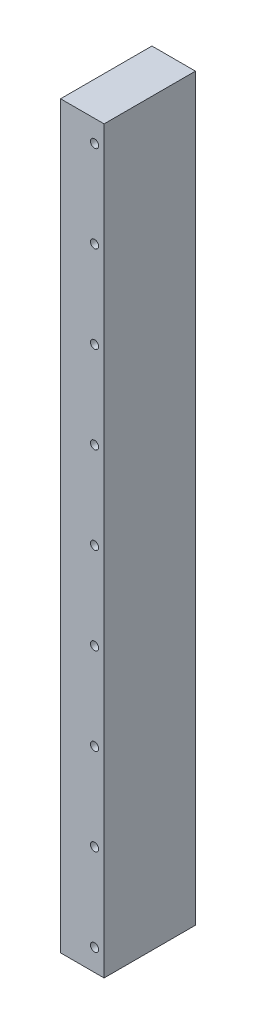
ISO-10303-21;
HEADER;
FILE_DESCRIPTION(('STEP AP214'),'2;1');
FILE_NAME('part.step','',(''),(''),'','','');
FILE_SCHEMA(('AUTOMOTIVE_DESIGN { 1 0 10303 214 1 1 1 1 }'));
ENDSEC;
DATA;
#1=APPLICATION_CONTEXT('core data for automotive mechanical design processes');
#2=APPLICATION_PROTOCOL_DEFINITION('international standard','automotive_design',2000,#1);
#3=PRODUCT_CONTEXT('',#1,'mechanical');
#4=PRODUCT('Part','Part','',(#3));
#5=PRODUCT_RELATED_PRODUCT_CATEGORY('part','',(#4));
#6=PRODUCT_DEFINITION_FORMATION('','',#4);
#7=PRODUCT_DEFINITION_CONTEXT('part definition',#1,'design');
#8=PRODUCT_DEFINITION('design','',#6,#7);
#9=PRODUCT_DEFINITION_SHAPE('','',#8);
#10=(LENGTH_UNIT() NAMED_UNIT(*) SI_UNIT(.MILLI.,.METRE.));
#11=(NAMED_UNIT(*) PLANE_ANGLE_UNIT() SI_UNIT($,.RADIAN.));
#12=(NAMED_UNIT(*) SI_UNIT($,.STERADIAN.) SOLID_ANGLE_UNIT());
#13=UNCERTAINTY_MEASURE_WITH_UNIT(LENGTH_MEASURE(1.E-05),#10,'distance_accuracy_value','');
#14=(GEOMETRIC_REPRESENTATION_CONTEXT(3) GLOBAL_UNCERTAINTY_ASSIGNED_CONTEXT((#13)) GLOBAL_UNIT_ASSIGNED_CONTEXT((#10,
#11,#12)) REPRESENTATION_CONTEXT('',''));
#15=CARTESIAN_POINT('',(0.,0.,0.));
#16=DIRECTION('',(0.,0.,1.));
#17=DIRECTION('',(1.,0.,0.));
#18=AXIS2_PLACEMENT_3D('',#15,#16,#17);
#19=CARTESIAN_POINT('',(-1.75,132.,-5.));
#20=DIRECTION('',(0.,0.,1.));
#21=DIRECTION('',(1.,0.,0.));
#22=AXIS2_PLACEMENT_3D('',#19,#20,#21);
#23=PLANE('',#22);
#24=CARTESIAN_POINT('',(-1.75,132.,-5.));
#25=DIRECTION('',(0.,0.,1.));
#26=DIRECTION('',(1.,0.,0.));
#27=AXIS2_PLACEMENT_3D('',#24,#25,#26);
#28=CIRCLE('',#27,0.75);
#29=CARTESIAN_POINT('',(-1.,132.,-5.));
#30=VERTEX_POINT('',#29);
#31=EDGE_CURVE('E11',#30,#30,#28,.T.);
#32=ORIENTED_EDGE('',*,*,#31,.T.);
#33=EDGE_LOOP('',(#32));
#34=FACE_BOUND('',#33,.T.);
#35=ADVANCED_FACE('F37',(#34),#23,.T.);
#36=CARTESIAN_POINT('',(-1.75,132.,-5.));
#37=DIRECTION('',(0.,0.,1.));
#38=DIRECTION('',(1.,0.,0.));
#39=AXIS2_PLACEMENT_3D('',#36,#37,#38);
#40=CYLINDRICAL_SURFACE('',#39,0.75);
#41=ORIENTED_EDGE('',*,*,#31,.F.);
#42=EDGE_LOOP('',(#41));
#43=FACE_BOUND('',#42,.T.);
#44=CARTESIAN_POINT('',(-1.75,132.,0.));
#45=DIRECTION('',(0.,0.,1.));
#46=DIRECTION('',(1.,0.,0.));
#47=AXIS2_PLACEMENT_3D('',#44,#45,#46);
#48=CIRCLE('',#47,0.75);
#49=CARTESIAN_POINT('',(-1.,132.,0.));
#50=VERTEX_POINT('',#49);
#51=EDGE_CURVE('E45',#50,#50,#48,.T.);
#52=ORIENTED_EDGE('',*,*,#51,.T.);
#53=EDGE_LOOP('',(#52));
#54=FACE_BOUND('',#53,.T.);
#55=ADVANCED_FACE('F153',(#43,#54),#40,.F.);
#56=CARTESIAN_POINT('',(-1.75,116.,-5.));
#57=DIRECTION('',(0.,0.,1.));
#58=DIRECTION('',(1.,0.,0.));
#59=AXIS2_PLACEMENT_3D('',#56,#57,#58);
#60=PLANE('',#59);
#61=CARTESIAN_POINT('',(-1.75,116.,-5.));
#62=DIRECTION('',(0.,0.,1.));
#63=DIRECTION('',(1.,0.,0.));
#64=AXIS2_PLACEMENT_3D('',#61,#62,#63);
#65=CIRCLE('',#64,0.75);
#66=CARTESIAN_POINT('',(-1.,116.,-5.));
#67=VERTEX_POINT('',#66);
#68=EDGE_CURVE('E148',#67,#67,#65,.T.);
#69=ORIENTED_EDGE('',*,*,#68,.T.);
#70=EDGE_LOOP('',(#69));
#71=FACE_BOUND('',#70,.T.);
#72=ADVANCED_FACE('F175',(#71),#60,.T.);
#73=CARTESIAN_POINT('',(-1.75,116.,-5.));
#74=DIRECTION('',(0.,0.,1.));
#75=DIRECTION('',(1.,0.,0.));
#76=AXIS2_PLACEMENT_3D('',#73,#74,#75);
#77=CYLINDRICAL_SURFACE('',#76,0.75);
#78=ORIENTED_EDGE('',*,*,#68,.F.);
#79=EDGE_LOOP('',(#78));
#80=FACE_BOUND('',#79,.T.);
#81=CARTESIAN_POINT('',(-1.75,116.,0.));
#82=DIRECTION('',(0.,0.,1.));
#83=DIRECTION('',(1.,0.,0.));
#84=AXIS2_PLACEMENT_3D('',#81,#82,#83);
#85=CIRCLE('',#84,0.75);
#86=CARTESIAN_POINT('',(-1.,116.,0.));
#87=VERTEX_POINT('',#86);
#88=EDGE_CURVE('E145',#87,#87,#85,.T.);
#89=ORIENTED_EDGE('',*,*,#88,.T.);
#90=EDGE_LOOP('',(#89));
#91=FACE_BOUND('',#90,.T.);
#92=ADVANCED_FACE('F181',(#80,#91),#77,.F.);
#93=CARTESIAN_POINT('',(-1.75,100.,-5.));
#94=DIRECTION('',(0.,0.,1.));
#95=DIRECTION('',(1.,0.,0.));
#96=AXIS2_PLACEMENT_3D('',#93,#94,#95);
#97=PLANE('',#96);
#98=CARTESIAN_POINT('',(-1.75,100.,-5.));
#99=DIRECTION('',(0.,0.,1.));
#100=DIRECTION('',(1.,0.,0.));
#101=AXIS2_PLACEMENT_3D('',#98,#99,#100);
#102=CIRCLE('',#101,0.75);
#103=CARTESIAN_POINT('',(-1.,100.,-5.));
#104=VERTEX_POINT('',#103);
#105=EDGE_CURVE('E142',#104,#104,#102,.T.);
#106=ORIENTED_EDGE('',*,*,#105,.T.);
#107=EDGE_LOOP('',(#106));
#108=FACE_BOUND('',#107,.T.);
#109=ADVANCED_FACE('F187',(#108),#97,.T.);
#110=CARTESIAN_POINT('',(-1.75,100.,-5.));
#111=DIRECTION('',(0.,0.,1.));
#112=DIRECTION('',(1.,0.,0.));
#113=AXIS2_PLACEMENT_3D('',#110,#111,#112);
#114=CYLINDRICAL_SURFACE('',#113,0.75);
#115=ORIENTED_EDGE('',*,*,#105,.F.);
#116=EDGE_LOOP('',(#115));
#117=FACE_BOUND('',#116,.T.);
#118=CARTESIAN_POINT('',(-1.75,100.,0.));
#119=DIRECTION('',(0.,0.,1.));
#120=DIRECTION('',(1.,0.,0.));
#121=AXIS2_PLACEMENT_3D('',#118,#119,#120);
#122=CIRCLE('',#121,0.75);
#123=CARTESIAN_POINT('',(-1.,100.,0.));
#124=VERTEX_POINT('',#123);
#125=EDGE_CURVE('E139',#124,#124,#122,.T.);
#126=ORIENTED_EDGE('',*,*,#125,.T.);
#127=EDGE_LOOP('',(#126));
#128=FACE_BOUND('',#127,.T.);
#129=ADVANCED_FACE('F191',(#117,#128),#114,.F.);
#130=CARTESIAN_POINT('',(-1.75,84.,-5.));
#131=DIRECTION('',(0.,0.,1.));
#132=DIRECTION('',(1.,0.,0.));
#133=AXIS2_PLACEMENT_3D('',#130,#131,#132);
#134=PLANE('',#133);
#135=CARTESIAN_POINT('',(-1.75,84.,-5.));
#136=DIRECTION('',(0.,0.,1.));
#137=DIRECTION('',(1.,0.,0.));
#138=AXIS2_PLACEMENT_3D('',#135,#136,#137);
#139=CIRCLE('',#138,0.75);
#140=CARTESIAN_POINT('',(-1.,84.,-5.));
#141=VERTEX_POINT('',#140);
#142=EDGE_CURVE('E136',#141,#141,#139,.T.);
#143=ORIENTED_EDGE('',*,*,#142,.T.);
#144=EDGE_LOOP('',(#143));
#145=FACE_BOUND('',#144,.T.);
#146=ADVANCED_FACE('F195',(#145),#134,.T.);
#147=CARTESIAN_POINT('',(-1.75,84.,-5.));
#148=DIRECTION('',(0.,0.,1.));
#149=DIRECTION('',(1.,0.,0.));
#150=AXIS2_PLACEMENT_3D('',#147,#148,#149);
#151=CYLINDRICAL_SURFACE('',#150,0.75);
#152=ORIENTED_EDGE('',*,*,#142,.F.);
#153=EDGE_LOOP('',(#152));
#154=FACE_BOUND('',#153,.T.);
#155=CARTESIAN_POINT('',(-1.75,84.,0.));
#156=DIRECTION('',(0.,0.,1.));
#157=DIRECTION('',(1.,0.,0.));
#158=AXIS2_PLACEMENT_3D('',#155,#156,#157);
#159=CIRCLE('',#158,0.75);
#160=CARTESIAN_POINT('',(-1.,84.,0.));
#161=VERTEX_POINT('',#160);
#162=EDGE_CURVE('E133',#161,#161,#159,.T.);
#163=ORIENTED_EDGE('',*,*,#162,.T.);
#164=EDGE_LOOP('',(#163));
#165=FACE_BOUND('',#164,.T.);
#166=ADVANCED_FACE('F199',(#154,#165),#151,.F.);
#167=CARTESIAN_POINT('',(-1.75,68.,-5.));
#168=DIRECTION('',(0.,0.,1.));
#169=DIRECTION('',(1.,0.,0.));
#170=AXIS2_PLACEMENT_3D('',#167,#168,#169);
#171=PLANE('',#170);
#172=CARTESIAN_POINT('',(-1.75,68.,-5.));
#173=DIRECTION('',(0.,0.,1.));
#174=DIRECTION('',(1.,0.,0.));
#175=AXIS2_PLACEMENT_3D('',#172,#173,#174);
#176=CIRCLE('',#175,0.75);
#177=CARTESIAN_POINT('',(-1.,68.,-5.));
#178=VERTEX_POINT('',#177);
#179=EDGE_CURVE('E130',#178,#178,#176,.T.);
#180=ORIENTED_EDGE('',*,*,#179,.T.);
#181=EDGE_LOOP('',(#180));
#182=FACE_BOUND('',#181,.T.);
#183=ADVANCED_FACE('F203',(#182),#171,.T.);
#184=CARTESIAN_POINT('',(-1.75,68.,-5.));
#185=DIRECTION('',(0.,0.,1.));
#186=DIRECTION('',(1.,0.,0.));
#187=AXIS2_PLACEMENT_3D('',#184,#185,#186);
#188=CYLINDRICAL_SURFACE('',#187,0.75);
#189=ORIENTED_EDGE('',*,*,#179,.F.);
#190=EDGE_LOOP('',(#189));
#191=FACE_BOUND('',#190,.T.);
#192=CARTESIAN_POINT('',(-1.75,68.,0.));
#193=DIRECTION('',(0.,0.,1.));
#194=DIRECTION('',(1.,0.,0.));
#195=AXIS2_PLACEMENT_3D('',#192,#193,#194);
#196=CIRCLE('',#195,0.75);
#197=CARTESIAN_POINT('',(-1.,68.,0.));
#198=VERTEX_POINT('',#197);
#199=EDGE_CURVE('E127',#198,#198,#196,.T.);
#200=ORIENTED_EDGE('',*,*,#199,.T.);
#201=EDGE_LOOP('',(#200));
#202=FACE_BOUND('',#201,.T.);
#203=ADVANCED_FACE('F207',(#191,#202),#188,.F.);
#204=CARTESIAN_POINT('',(-1.75,52.,-5.));
#205=DIRECTION('',(0.,0.,1.));
#206=DIRECTION('',(1.,0.,0.));
#207=AXIS2_PLACEMENT_3D('',#204,#205,#206);
#208=PLANE('',#207);
#209=CARTESIAN_POINT('',(-1.75,52.,-5.));
#210=DIRECTION('',(0.,0.,1.));
#211=DIRECTION('',(1.,0.,0.));
#212=AXIS2_PLACEMENT_3D('',#209,#210,#211);
#213=CIRCLE('',#212,0.75);
#214=CARTESIAN_POINT('',(-1.,52.,-5.));
#215=VERTEX_POINT('',#214);
#216=EDGE_CURVE('E124',#215,#215,#213,.T.);
#217=ORIENTED_EDGE('',*,*,#216,.T.);
#218=EDGE_LOOP('',(#217));
#219=FACE_BOUND('',#218,.T.);
#220=ADVANCED_FACE('F211',(#219),#208,.T.);
#221=CARTESIAN_POINT('',(-1.75,52.,-5.));
#222=DIRECTION('',(0.,0.,1.));
#223=DIRECTION('',(1.,0.,0.));
#224=AXIS2_PLACEMENT_3D('',#221,#222,#223);
#225=CYLINDRICAL_SURFACE('',#224,0.75);
#226=ORIENTED_EDGE('',*,*,#216,.F.);
#227=EDGE_LOOP('',(#226));
#228=FACE_BOUND('',#227,.T.);
#229=CARTESIAN_POINT('',(-1.75,52.,0.));
#230=DIRECTION('',(0.,0.,1.));
#231=DIRECTION('',(1.,0.,0.));
#232=AXIS2_PLACEMENT_3D('',#229,#230,#231);
#233=CIRCLE('',#232,0.75);
#234=CARTESIAN_POINT('',(-1.,52.,0.));
#235=VERTEX_POINT('',#234);
#236=EDGE_CURVE('E121',#235,#235,#233,.T.);
#237=ORIENTED_EDGE('',*,*,#236,.T.);
#238=EDGE_LOOP('',(#237));
#239=FACE_BOUND('',#238,.T.);
#240=ADVANCED_FACE('F215',(#228,#239),#225,.F.);
#241=CARTESIAN_POINT('',(-1.75,36.,-5.));
#242=DIRECTION('',(0.,0.,1.));
#243=DIRECTION('',(1.,0.,0.));
#244=AXIS2_PLACEMENT_3D('',#241,#242,#243);
#245=PLANE('',#244);
#246=CARTESIAN_POINT('',(-1.75,36.,-5.));
#247=DIRECTION('',(0.,0.,1.));
#248=DIRECTION('',(1.,0.,0.));
#249=AXIS2_PLACEMENT_3D('',#246,#247,#248);
#250=CIRCLE('',#249,0.75);
#251=CARTESIAN_POINT('',(-1.,36.,-5.));
#252=VERTEX_POINT('',#251);
#253=EDGE_CURVE('E118',#252,#252,#250,.T.);
#254=ORIENTED_EDGE('',*,*,#253,.T.);
#255=EDGE_LOOP('',(#254));
#256=FACE_BOUND('',#255,.T.);
#257=ADVANCED_FACE('F219',(#256),#245,.T.);
#258=CARTESIAN_POINT('',(-1.75,36.,-5.));
#259=DIRECTION('',(0.,0.,1.));
#260=DIRECTION('',(1.,0.,0.));
#261=AXIS2_PLACEMENT_3D('',#258,#259,#260);
#262=CYLINDRICAL_SURFACE('',#261,0.75);
#263=ORIENTED_EDGE('',*,*,#253,.F.);
#264=EDGE_LOOP('',(#263));
#265=FACE_BOUND('',#264,.T.);
#266=CARTESIAN_POINT('',(-1.75,36.,0.));
#267=DIRECTION('',(0.,0.,1.));
#268=DIRECTION('',(1.,0.,0.));
#269=AXIS2_PLACEMENT_3D('',#266,#267,#268);
#270=CIRCLE('',#269,0.75);
#271=CARTESIAN_POINT('',(-1.,36.,0.));
#272=VERTEX_POINT('',#271);
#273=EDGE_CURVE('E115',#272,#272,#270,.T.);
#274=ORIENTED_EDGE('',*,*,#273,.T.);
#275=EDGE_LOOP('',(#274));
#276=FACE_BOUND('',#275,.T.);
#277=ADVANCED_FACE('F165',(#265,#276),#262,.F.);
#278=CARTESIAN_POINT('',(-8.00000000000001,136.,-16.8));
#279=DIRECTION('',(1.,0.,0.));
#280=DIRECTION('',(0.,0.,-1.));
#281=AXIS2_PLACEMENT_3D('',#278,#279,#280);
#282=PLANE('',#281);
#283=DIRECTION('',(0.,0.,1.));
#284=VECTOR('',#283,1.);
#285=CARTESIAN_POINT('',(-8.00000000000001,0.,-16.8));
#286=LINE('',#285,#284);
#287=CARTESIAN_POINT('',(-8.00000000000001,0.,-16.8));
#288=VERTEX_POINT('',#287);
#289=CARTESIAN_POINT('',(-8.,0.,0.));
#290=VERTEX_POINT('',#289);
#291=EDGE_CURVE('E105',#288,#290,#286,.T.);
#292=ORIENTED_EDGE('',*,*,#291,.T.);
#293=DIRECTION('',(0.,-1.,0.));
#294=VECTOR('',#293,1.);
#295=CARTESIAN_POINT('',(-8.,136.,0.));
#296=LINE('',#295,#294);
#297=CARTESIAN_POINT('',(-8.,136.,0.));
#298=VERTEX_POINT('',#297);
#299=EDGE_CURVE('E96',#298,#290,#296,.T.);
#300=ORIENTED_EDGE('',*,*,#299,.F.);
#301=DIRECTION('',(0.,0.,1.));
#302=VECTOR('',#301,1.);
#303=CARTESIAN_POINT('',(-8.00000000000001,136.,-16.8));
#304=LINE('',#303,#302);
#305=CARTESIAN_POINT('',(-8.00000000000001,136.,-16.8));
#306=VERTEX_POINT('',#305);
#307=EDGE_CURVE('E89',#306,#298,#304,.T.);
#308=ORIENTED_EDGE('',*,*,#307,.F.);
#309=DIRECTION('',(0.,-1.,0.));
#310=VECTOR('',#309,1.);
#311=CARTESIAN_POINT('',(-8.00000000000001,136.,-16.8));
#312=LINE('',#311,#310);
#313=EDGE_CURVE('E101',#306,#288,#312,.T.);
#314=ORIENTED_EDGE('',*,*,#313,.T.);
#315=EDGE_LOOP('',(#292,#300,#308,#314));
#316=FACE_BOUND('',#315,.T.);
#317=ADVANCED_FACE('F156',(#316),#282,.F.);
#318=CARTESIAN_POINT('',(-8.,136.,0.));
#319=DIRECTION('',(0.,0.,-1.));
#320=DIRECTION('',(-1.,0.,0.));
#321=AXIS2_PLACEMENT_3D('',#318,#319,#320);
#322=PLANE('',#321);
#323=CARTESIAN_POINT('',(-1.75,20.,0.));
#324=DIRECTION('',(0.,0.,1.));
#325=DIRECTION('',(1.,0.,0.));
#326=AXIS2_PLACEMENT_3D('',#323,#324,#325);
#327=CIRCLE('',#326,0.75);
#328=CARTESIAN_POINT('',(-1.,20.,0.));
#329=VERTEX_POINT('',#328);
#330=EDGE_CURVE('E407',#329,#329,#327,.T.);
#331=ORIENTED_EDGE('',*,*,#330,.F.);
#332=EDGE_LOOP('',(#331));
#333=FACE_BOUND('',#332,.T.);
#334=CARTESIAN_POINT('',(-1.75,4.,0.));
#335=DIRECTION('',(0.,0.,1.));
#336=DIRECTION('',(1.,0.,0.));
#337=AXIS2_PLACEMENT_3D('',#334,#335,#336);
#338=CIRCLE('',#337,0.75);
#339=CARTESIAN_POINT('',(-1.,4.,0.));
#340=VERTEX_POINT('',#339);
#341=EDGE_CURVE('E406',#340,#340,#338,.T.);
#342=ORIENTED_EDGE('',*,*,#341,.F.);
#343=EDGE_LOOP('',(#342));
#344=FACE_BOUND('',#343,.T.);
#345=DIRECTION('',(1.,0.,0.));
#346=VECTOR('',#345,1.);
#347=CARTESIAN_POINT('',(-8.,0.,0.));
#348=LINE('',#347,#346);
#349=CARTESIAN_POINT('',(0.,0.,0.));
#350=VERTEX_POINT('',#349);
#351=EDGE_CURVE('E95',#290,#350,#348,.T.);
#352=ORIENTED_EDGE('',*,*,#351,.T.);
#353=DIRECTION('',(0.,-1.,0.));
#354=VECTOR('',#353,1.);
#355=CARTESIAN_POINT('',(0.,136.,0.));
#356=LINE('',#355,#354);
#357=CARTESIAN_POINT('',(0.,136.,0.));
#358=VERTEX_POINT('',#357);
#359=EDGE_CURVE('E92',#358,#350,#356,.T.);
#360=ORIENTED_EDGE('',*,*,#359,.F.);
#361=DIRECTION('',(1.,0.,0.));
#362=VECTOR('',#361,1.);
#363=CARTESIAN_POINT('',(-8.,136.,0.));
#364=LINE('',#363,#362);
#365=EDGE_CURVE('E84',#298,#358,#364,.T.);
#366=ORIENTED_EDGE('',*,*,#365,.F.);
#367=ORIENTED_EDGE('',*,*,#299,.T.);
#368=EDGE_LOOP('',(#352,#360,#366,#367));
#369=FACE_BOUND('',#368,.T.);
#370=ORIENTED_EDGE('',*,*,#273,.F.);
#371=EDGE_LOOP('',(#370));
#372=FACE_BOUND('',#371,.T.);
#373=ORIENTED_EDGE('',*,*,#236,.F.);
#374=EDGE_LOOP('',(#373));
#375=FACE_BOUND('',#374,.T.);
#376=ORIENTED_EDGE('',*,*,#199,.F.);
#377=EDGE_LOOP('',(#376));
#378=FACE_BOUND('',#377,.T.);
#379=ORIENTED_EDGE('',*,*,#162,.F.);
#380=EDGE_LOOP('',(#379));
#381=FACE_BOUND('',#380,.T.);
#382=ORIENTED_EDGE('',*,*,#125,.F.);
#383=EDGE_LOOP('',(#382));
#384=FACE_BOUND('',#383,.T.);
#385=ORIENTED_EDGE('',*,*,#88,.F.);
#386=EDGE_LOOP('',(#385));
#387=FACE_BOUND('',#386,.T.);
#388=ORIENTED_EDGE('',*,*,#51,.F.);
#389=EDGE_LOOP('',(#388));
#390=FACE_BOUND('',#389,.T.);
#391=ADVANCED_FACE('F93',(#333,#344,#369,#372,#375,#378,#381,#384,#387,#390),#322,.F.);
#392=CARTESIAN_POINT('',(0.,136.,0.));
#393=DIRECTION('',(-1.,0.,0.));
#394=DIRECTION('',(0.,0.,1.));
#395=AXIS2_PLACEMENT_3D('',#392,#393,#394);
#396=PLANE('',#395);
#397=DIRECTION('',(0.,0.,-1.));
#398=VECTOR('',#397,1.);
#399=CARTESIAN_POINT('',(0.,0.,0.));
#400=LINE('',#399,#398);
#401=CARTESIAN_POINT('',(0.,0.,-16.8));
#402=VERTEX_POINT('',#401);
#403=EDGE_CURVE('E70',#350,#402,#400,.T.);
#404=ORIENTED_EDGE('',*,*,#403,.T.);
#405=DIRECTION('',(0.,-1.,0.));
#406=VECTOR('',#405,1.);
#407=CARTESIAN_POINT('',(0.,136.,-16.8));
#408=LINE('',#407,#406);
#409=CARTESIAN_POINT('',(0.,136.,-16.8));
#410=VERTEX_POINT('',#409);
#411=EDGE_CURVE('E97',#410,#402,#408,.T.);
#412=ORIENTED_EDGE('',*,*,#411,.F.);
#413=DIRECTION('',(0.,0.,-1.));
#414=VECTOR('',#413,1.);
#415=CARTESIAN_POINT('',(0.,136.,0.));
#416=LINE('',#415,#414);
#417=EDGE_CURVE('E87',#358,#410,#416,.T.);
#418=ORIENTED_EDGE('',*,*,#417,.F.);
#419=ORIENTED_EDGE('',*,*,#359,.T.);
#420=EDGE_LOOP('',(#404,#412,#418,#419));
#421=FACE_BOUND('',#420,.T.);
#422=ADVANCED_FACE('F99',(#421),#396,.F.);
#423=CARTESIAN_POINT('',(0.,136.,-16.8));
#424=DIRECTION('',(0.,0.,1.));
#425=DIRECTION('',(1.,0.,0.));
#426=AXIS2_PLACEMENT_3D('',#423,#424,#425);
#427=PLANE('',#426);
#428=DIRECTION('',(-1.,0.,0.));
#429=VECTOR('',#428,1.);
#430=CARTESIAN_POINT('',(0.,0.,-16.8));
#431=LINE('',#430,#429);
#432=EDGE_CURVE('E76',#402,#288,#431,.T.);
#433=ORIENTED_EDGE('',*,*,#432,.T.);
#434=ORIENTED_EDGE('',*,*,#313,.F.);
#435=DIRECTION('',(-1.,0.,0.));
#436=VECTOR('',#435,1.);
#437=CARTESIAN_POINT('',(0.,136.,-16.8));
#438=LINE('',#437,#436);
#439=EDGE_CURVE('E53',#410,#306,#438,.T.);
#440=ORIENTED_EDGE('',*,*,#439,.F.);
#441=ORIENTED_EDGE('',*,*,#411,.T.);
#442=EDGE_LOOP('',(#433,#434,#440,#441));
#443=FACE_BOUND('',#442,.T.);
#444=ADVANCED_FACE('F163',(#443),#427,.F.);
#445=CARTESIAN_POINT('',(0.,136.,0.));
#446=DIRECTION('',(0.,1.,0.));
#447=DIRECTION('',(0.,0.,1.));
#448=AXIS2_PLACEMENT_3D('',#445,#446,#447);
#449=PLANE('',#448);
#450=ORIENTED_EDGE('',*,*,#307,.T.);
#451=ORIENTED_EDGE('',*,*,#365,.T.);
#452=ORIENTED_EDGE('',*,*,#417,.T.);
#453=ORIENTED_EDGE('',*,*,#439,.T.);
#454=EDGE_LOOP('',(#450,#451,#452,#453));
#455=FACE_BOUND('',#454,.T.);
#456=ADVANCED_FACE('F85',(#455),#449,.T.);
#457=CARTESIAN_POINT('',(0.,0.,0.));
#458=DIRECTION('',(0.,1.,0.));
#459=DIRECTION('',(0.,0.,1.));
#460=AXIS2_PLACEMENT_3D('',#457,#458,#459);
#461=PLANE('',#460);
#462=ORIENTED_EDGE('',*,*,#291,.F.);
#463=ORIENTED_EDGE('',*,*,#432,.F.);
#464=ORIENTED_EDGE('',*,*,#403,.F.);
#465=ORIENTED_EDGE('',*,*,#351,.F.);
#466=EDGE_LOOP('',(#462,#463,#464,#465));
#467=FACE_BOUND('',#466,.T.);
#468=ADVANCED_FACE('F277',(#467),#461,.F.);
#469=CARTESIAN_POINT('',(-1.75,4.,-5.));
#470=DIRECTION('',(0.,0.,1.));
#471=DIRECTION('',(1.,0.,0.));
#472=AXIS2_PLACEMENT_3D('',#469,#470,#471);
#473=CYLINDRICAL_SURFACE('',#472,0.75);
#474=CARTESIAN_POINT('',(-1.75,4.,-5.));
#475=DIRECTION('',(0.,0.,1.));
#476=DIRECTION('',(1.,0.,0.));
#477=AXIS2_PLACEMENT_3D('',#474,#475,#476);
#478=CIRCLE('',#477,0.75);
#479=CARTESIAN_POINT('',(-1.,4.,-5.));
#480=VERTEX_POINT('',#479);
#481=EDGE_CURVE('E108',#480,#480,#478,.T.);
#482=ORIENTED_EDGE('',*,*,#481,.F.);
#483=EDGE_LOOP('',(#482));
#484=FACE_BOUND('',#483,.T.);
#485=ORIENTED_EDGE('',*,*,#341,.T.);
#486=EDGE_LOOP('',(#485));
#487=FACE_BOUND('',#486,.T.);
#488=ADVANCED_FACE('F286',(#484,#487),#473,.F.);
#489=CARTESIAN_POINT('',(-1.75,4.,-5.));
#490=DIRECTION('',(0.,0.,1.));
#491=DIRECTION('',(1.,0.,0.));
#492=AXIS2_PLACEMENT_3D('',#489,#490,#491);
#493=PLANE('',#492);
#494=ORIENTED_EDGE('',*,*,#481,.T.);
#495=EDGE_LOOP('',(#494));
#496=FACE_BOUND('',#495,.T.);
#497=ADVANCED_FACE('F295',(#496),#493,.T.);
#498=CARTESIAN_POINT('',(-1.75,20.,-5.));
#499=DIRECTION('',(0.,0.,1.));
#500=DIRECTION('',(1.,0.,0.));
#501=AXIS2_PLACEMENT_3D('',#498,#499,#500);
#502=CYLINDRICAL_SURFACE('',#501,0.75);
#503=CARTESIAN_POINT('',(-1.75,20.,-5.));
#504=DIRECTION('',(0.,0.,1.));
#505=DIRECTION('',(1.,0.,0.));
#506=AXIS2_PLACEMENT_3D('',#503,#504,#505);
#507=CIRCLE('',#506,0.75);
#508=CARTESIAN_POINT('',(-1.,20.,-5.));
#509=VERTEX_POINT('',#508);
#510=EDGE_CURVE('E405',#509,#509,#507,.T.);
#511=ORIENTED_EDGE('',*,*,#510,.F.);
#512=EDGE_LOOP('',(#511));
#513=FACE_BOUND('',#512,.T.);
#514=ORIENTED_EDGE('',*,*,#330,.T.);
#515=EDGE_LOOP('',(#514));
#516=FACE_BOUND('',#515,.T.);
#517=ADVANCED_FACE('F304',(#513,#516),#502,.F.);
#518=CARTESIAN_POINT('',(-1.75,20.,-5.));
#519=DIRECTION('',(0.,0.,1.));
#520=DIRECTION('',(1.,0.,0.));
#521=AXIS2_PLACEMENT_3D('',#518,#519,#520);
#522=PLANE('',#521);
#523=ORIENTED_EDGE('',*,*,#510,.T.);
#524=EDGE_LOOP('',(#523));
#525=FACE_BOUND('',#524,.T.);
#526=ADVANCED_FACE('F390',(#525),#522,.T.);
#527=CLOSED_SHELL('',(#35,#55,#72,#92,#109,#129,#146,#166,#183,#203,#220,#240,#257,#277,#317,
#391,#422,#444,#456,#468,#488,#497,#517,#526));
#528=MANIFOLD_SOLID_BREP('B2',#527);
#529=ADVANCED_BREP_SHAPE_REPRESENTATION('',(#18,#528),#14);
#530=SHAPE_DEFINITION_REPRESENTATION(#9,#529);
ENDSEC;
END-ISO-10303-21;
